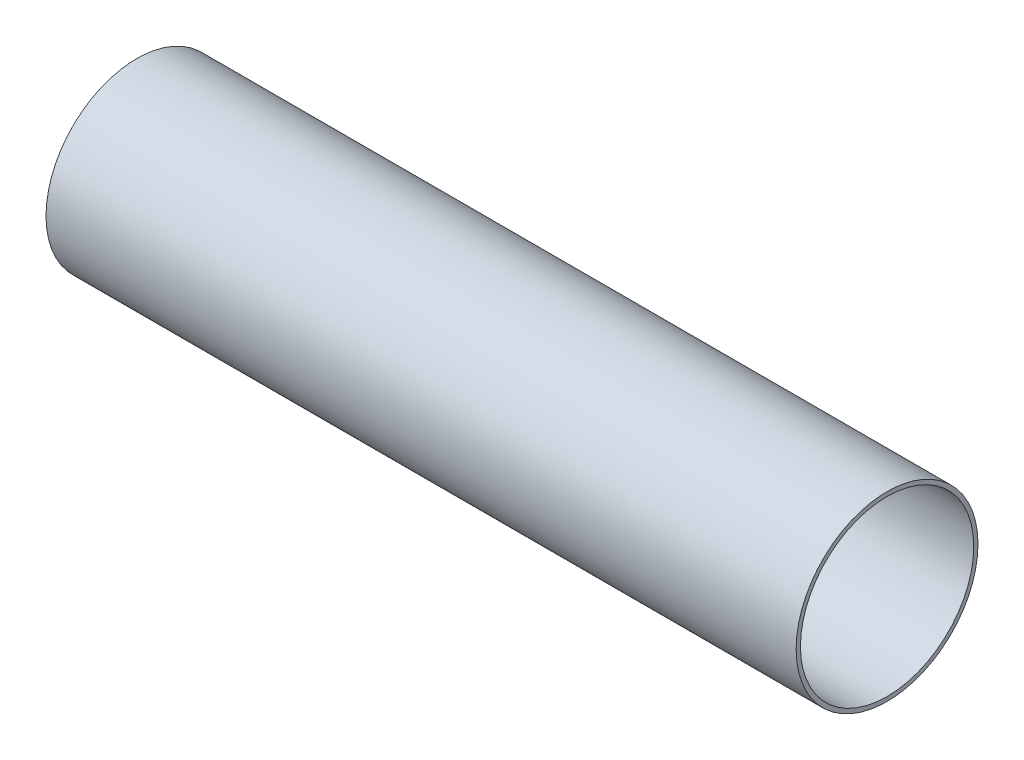
ISO-10303-21;
HEADER;
FILE_DESCRIPTION(('STEP AP214'),'2;1');
FILE_NAME('part.step','',(''),(''),'','','');
FILE_SCHEMA(('AUTOMOTIVE_DESIGN { 1 0 10303 214 1 1 1 1 }'));
ENDSEC;
DATA;
#1=APPLICATION_CONTEXT('core data for automotive mechanical design processes');
#2=APPLICATION_PROTOCOL_DEFINITION('international standard','automotive_design',2000,#1);
#3=PRODUCT_CONTEXT('',#1,'mechanical');
#4=PRODUCT('Part','Part','',(#3));
#5=PRODUCT_RELATED_PRODUCT_CATEGORY('part','',(#4));
#6=PRODUCT_DEFINITION_FORMATION('','',#4);
#7=PRODUCT_DEFINITION_CONTEXT('part definition',#1,'design');
#8=PRODUCT_DEFINITION('design','',#6,#7);
#9=PRODUCT_DEFINITION_SHAPE('','',#8);
#10=(LENGTH_UNIT() NAMED_UNIT(*) SI_UNIT(.MILLI.,.METRE.));
#11=(NAMED_UNIT(*) PLANE_ANGLE_UNIT() SI_UNIT($,.RADIAN.));
#12=(NAMED_UNIT(*) SI_UNIT($,.STERADIAN.) SOLID_ANGLE_UNIT());
#13=UNCERTAINTY_MEASURE_WITH_UNIT(LENGTH_MEASURE(1.E-05),#10,'distance_accuracy_value','');
#14=(GEOMETRIC_REPRESENTATION_CONTEXT(3) GLOBAL_UNCERTAINTY_ASSIGNED_CONTEXT((#13)) GLOBAL_UNIT_ASSIGNED_CONTEXT((#10,
#11,#12)) REPRESENTATION_CONTEXT('',''));
#15=CARTESIAN_POINT('',(0.,0.,0.));
#16=DIRECTION('',(0.,0.,1.));
#17=DIRECTION('',(1.,0.,0.));
#18=AXIS2_PLACEMENT_3D('',#15,#16,#17);
#19=CARTESIAN_POINT('',(838.2,0.,0.));
#20=DIRECTION('',(1.,0.,0.));
#21=DIRECTION('',(0.,0.,-1.));
#22=AXIS2_PLACEMENT_3D('',#19,#20,#21);
#23=PLANE('',#22);
#24=CARTESIAN_POINT('',(838.2,0.,0.));
#25=DIRECTION('',(1.,0.,0.));
#26=DIRECTION('',(0.,0.,-1.));
#27=AXIS2_PLACEMENT_3D('',#24,#25,#26);
#28=CIRCLE('',#27,101.6);
#29=CARTESIAN_POINT('',(838.2,0.,-101.6));
#30=VERTEX_POINT('',#29);
#31=EDGE_CURVE('E10',#30,#30,#28,.T.);
#32=ORIENTED_EDGE('',*,*,#31,.T.);
#33=EDGE_LOOP('',(#32));
#34=FACE_BOUND('',#33,.T.);
#35=CARTESIAN_POINT('',(838.2,0.,0.));
#36=DIRECTION('',(1.,0.,0.));
#37=DIRECTION('',(0.,0.,-1.));
#38=AXIS2_PLACEMENT_3D('',#35,#36,#37);
#39=CIRCLE('',#38,96.8375);
#40=CARTESIAN_POINT('',(838.2,0.,-96.8375));
#41=VERTEX_POINT('',#40);
#42=EDGE_CURVE('E50',#41,#41,#39,.T.);
#43=ORIENTED_EDGE('',*,*,#42,.F.);
#44=EDGE_LOOP('',(#43));
#45=FACE_BOUND('',#44,.T.);
#46=ADVANCED_FACE('F37',(#34,#45),#23,.T.);
#47=CARTESIAN_POINT('',(0.,0.,0.));
#48=DIRECTION('',(1.,0.,0.));
#49=DIRECTION('',(0.,0.,-1.));
#50=AXIS2_PLACEMENT_3D('',#47,#48,#49);
#51=PLANE('',#50);
#52=CARTESIAN_POINT('',(0.,0.,0.));
#53=DIRECTION('',(1.,0.,0.));
#54=DIRECTION('',(0.,0.,-1.));
#55=AXIS2_PLACEMENT_3D('',#52,#53,#54);
#56=CIRCLE('',#55,101.6);
#57=CARTESIAN_POINT('',(0.,0.,-101.6));
#58=VERTEX_POINT('',#57);
#59=EDGE_CURVE('E41',#58,#58,#56,.T.);
#60=ORIENTED_EDGE('',*,*,#59,.F.);
#61=EDGE_LOOP('',(#60));
#62=FACE_BOUND('',#61,.T.);
#63=CARTESIAN_POINT('',(0.,0.,0.));
#64=DIRECTION('',(1.,0.,0.));
#65=DIRECTION('',(0.,0.,-1.));
#66=AXIS2_PLACEMENT_3D('',#63,#64,#65);
#67=CIRCLE('',#66,96.8375);
#68=CARTESIAN_POINT('',(0.,0.,-96.8375));
#69=VERTEX_POINT('',#68);
#70=EDGE_CURVE('E52',#69,#69,#67,.T.);
#71=ORIENTED_EDGE('',*,*,#70,.T.);
#72=EDGE_LOOP('',(#71));
#73=FACE_BOUND('',#72,.T.);
#74=ADVANCED_FACE('F64',(#62,#73),#51,.F.);
#75=CARTESIAN_POINT('',(838.2,0.,0.));
#76=DIRECTION('',(-1.,0.,0.));
#77=DIRECTION('',(0.,0.,1.));
#78=AXIS2_PLACEMENT_3D('',#75,#76,#77);
#79=CYLINDRICAL_SURFACE('',#78,101.6);
#80=ORIENTED_EDGE('',*,*,#31,.F.);
#81=EDGE_LOOP('',(#80));
#82=FACE_BOUND('',#81,.T.);
#83=ORIENTED_EDGE('',*,*,#59,.T.);
#84=EDGE_LOOP('',(#83));
#85=FACE_BOUND('',#84,.T.);
#86=ADVANCED_FACE('F39',(#82,#85),#79,.T.);
#87=CARTESIAN_POINT('',(838.2,0.,0.));
#88=DIRECTION('',(-1.,0.,0.));
#89=DIRECTION('',(0.,0.,1.));
#90=AXIS2_PLACEMENT_3D('',#87,#88,#89);
#91=CYLINDRICAL_SURFACE('',#90,96.8375);
#92=ORIENTED_EDGE('',*,*,#42,.T.);
#93=EDGE_LOOP('',(#92));
#94=FACE_BOUND('',#93,.T.);
#95=ORIENTED_EDGE('',*,*,#70,.F.);
#96=EDGE_LOOP('',(#95));
#97=FACE_BOUND('',#96,.T.);
#98=ADVANCED_FACE('F60',(#94,#97),#91,.F.);
#99=CLOSED_SHELL('',(#46,#74,#86,#98));
#100=MANIFOLD_SOLID_BREP('B2',#99);
#101=ADVANCED_BREP_SHAPE_REPRESENTATION('',(#18,#100),#14);
#102=SHAPE_DEFINITION_REPRESENTATION(#9,#101);
ENDSEC;
END-ISO-10303-21;
